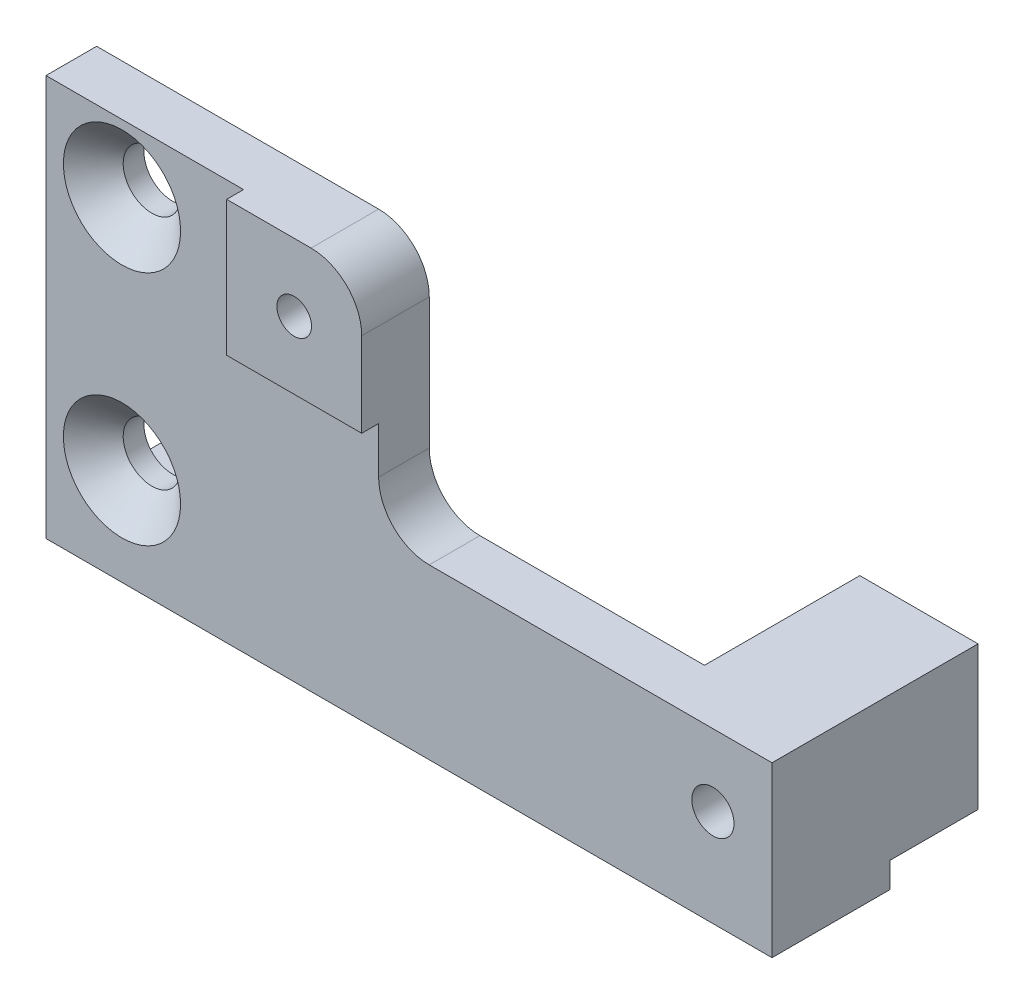
ISO-10303-21;
HEADER;
FILE_DESCRIPTION(('STEP AP214'),'2;1');
FILE_NAME('part.step','',(''),(''),'','','');
FILE_SCHEMA(('AUTOMOTIVE_DESIGN { 1 0 10303 214 1 1 1 1 }'));
ENDSEC;
DATA;
#1=APPLICATION_CONTEXT('core data for automotive mechanical design processes');
#2=APPLICATION_PROTOCOL_DEFINITION('international standard','automotive_design',2000,#1);
#3=PRODUCT_CONTEXT('',#1,'mechanical');
#4=PRODUCT('Part','Part','',(#3));
#5=PRODUCT_RELATED_PRODUCT_CATEGORY('part','',(#4));
#6=PRODUCT_DEFINITION_FORMATION('','',#4);
#7=PRODUCT_DEFINITION_CONTEXT('part definition',#1,'design');
#8=PRODUCT_DEFINITION('design','',#6,#7);
#9=PRODUCT_DEFINITION_SHAPE('','',#8);
#10=(LENGTH_UNIT() NAMED_UNIT(*) SI_UNIT(.MILLI.,.METRE.));
#11=(NAMED_UNIT(*) PLANE_ANGLE_UNIT() SI_UNIT($,.RADIAN.));
#12=(NAMED_UNIT(*) SI_UNIT($,.STERADIAN.) SOLID_ANGLE_UNIT());
#13=UNCERTAINTY_MEASURE_WITH_UNIT(LENGTH_MEASURE(1.E-05),#10,'distance_accuracy_value','');
#14=(GEOMETRIC_REPRESENTATION_CONTEXT(3) GLOBAL_UNCERTAINTY_ASSIGNED_CONTEXT((#13)) GLOBAL_UNIT_ASSIGNED_CONTEXT((#10,
#11,#12)) REPRESENTATION_CONTEXT('',''));
#15=CARTESIAN_POINT('',(0.,0.,0.));
#16=DIRECTION('',(0.,0.,1.));
#17=DIRECTION('',(1.,0.,0.));
#18=AXIS2_PLACEMENT_3D('',#15,#16,#17);
#19=CARTESIAN_POINT('',(33.,4.5,-9.19999999999995));
#20=DIRECTION('',(0.,0.,1.));
#21=DIRECTION('',(1.,0.,0.));
#22=AXIS2_PLACEMENT_3D('',#19,#20,#21);
#23=CYLINDRICAL_SURFACE('',#22,3.);
#24=DIRECTION('',(0.,0.,1.));
#25=VECTOR('',#24,1.);
#26=CARTESIAN_POINT('',(33.,1.5,-3.99999999999995));
#27=LINE('',#26,#25);
#28=CARTESIAN_POINT('',(33.,1.5,0.));
#29=VERTEX_POINT('',#28);
#30=CARTESIAN_POINT('',(33.,1.5,-3.99999999999996));
#31=VERTEX_POINT('',#30);
#32=EDGE_CURVE('E138',#29,#31,#27,.F.);
#33=ORIENTED_EDGE('',*,*,#32,.F.);
#34=CARTESIAN_POINT('',(33.,4.5,0.));
#35=DIRECTION('',(0.,0.,1.));
#36=DIRECTION('',(1.,0.,0.));
#37=AXIS2_PLACEMENT_3D('',#34,#35,#36);
#38=CIRCLE('',#37,3.);
#39=CARTESIAN_POINT('',(36.,4.5,0.));
#40=VERTEX_POINT('',#39);
#41=EDGE_CURVE('E206',#40,#29,#38,.F.);
#42=ORIENTED_EDGE('',*,*,#41,.F.);
#43=DIRECTION('',(0.,0.,-1.));
#44=VECTOR('',#43,1.);
#45=CARTESIAN_POINT('',(36.,4.5,-9.19999999999995));
#46=LINE('',#45,#44);
#47=CARTESIAN_POINT('',(36.,4.5,-3.99999999999995));
#48=VERTEX_POINT('',#47);
#49=EDGE_CURVE('E131',#40,#48,#46,.T.);
#50=ORIENTED_EDGE('',*,*,#49,.T.);
#51=CARTESIAN_POINT('',(33.,4.5,-3.99999999999996));
#52=DIRECTION('',(0.,0.,1.));
#53=DIRECTION('',(1.,0.,0.));
#54=AXIS2_PLACEMENT_3D('',#51,#52,#53);
#55=CIRCLE('',#54,3.);
#56=EDGE_CURVE('E19',#48,#31,#55,.F.);
#57=ORIENTED_EDGE('',*,*,#56,.T.);
#58=EDGE_LOOP('',(#33,#42,#50,#57));
#59=FACE_BOUND('',#58,.T.);
#60=ADVANCED_FACE('F16',(#59),#23,.F.);
#61=CARTESIAN_POINT('',(15.7,19.75,0.));
#62=DIRECTION('',(0.,0.,1.));
#63=DIRECTION('',(1.,0.,0.));
#64=AXIS2_PLACEMENT_3D('',#61,#62,#63);
#65=CYLINDRICAL_SURFACE('',#64,1.025);
#66=CARTESIAN_POINT('',(15.7,19.75,0.));
#67=DIRECTION('',(0.,0.,1.));
#68=DIRECTION('',(1.,0.,0.));
#69=AXIS2_PLACEMENT_3D('',#66,#67,#68);
#70=CIRCLE('',#69,1.025);
#71=CARTESIAN_POINT('',(16.725,19.75,0.));
#72=VERTEX_POINT('',#71);
#73=EDGE_CURVE('E154',#72,#72,#70,.T.);
#74=ORIENTED_EDGE('',*,*,#73,.F.);
#75=EDGE_LOOP('',(#74));
#76=FACE_BOUND('',#75,.T.);
#77=CARTESIAN_POINT('',(15.7,19.75,4.));
#78=DIRECTION('',(0.,0.,1.));
#79=DIRECTION('',(1.,0.,0.));
#80=AXIS2_PLACEMENT_3D('',#77,#78,#79);
#81=CIRCLE('',#80,1.025);
#82=CARTESIAN_POINT('',(16.725,19.75,4.));
#83=VERTEX_POINT('',#82);
#84=EDGE_CURVE('E203',#83,#83,#81,.F.);
#85=ORIENTED_EDGE('',*,*,#84,.F.);
#86=EDGE_LOOP('',(#85));
#87=FACE_BOUND('',#86,.T.);
#88=ADVANCED_FACE('F223',(#76,#87),#65,.F.);
#89=CARTESIAN_POINT('',(4.5,19.7500000000001,-47.));
#90=DIRECTION('',(0.,0.,-1.));
#91=DIRECTION('',(-1.,0.,0.));
#92=AXIS2_PLACEMENT_3D('',#89,#90,#91);
#93=CYLINDRICAL_SURFACE('',#92,1.7);
#94=CARTESIAN_POINT('',(4.5,19.7500000000001,1.22999999842932));
#95=DIRECTION('',(0.,0.,1.));
#96=DIRECTION('',(1.,0.,0.));
#97=AXIS2_PLACEMENT_3D('',#94,#95,#96);
#98=CIRCLE('',#97,1.7000000016269);
#99=CARTESIAN_POINT('',(6.2000000016269,19.7500000000001,1.22999999842932));
#100=VERTEX_POINT('',#99);
#101=EDGE_CURVE('E200',#100,#100,#98,.T.);
#102=ORIENTED_EDGE('',*,*,#101,.T.);
#103=EDGE_LOOP('',(#102));
#104=FACE_BOUND('',#103,.T.);
#105=CARTESIAN_POINT('',(4.5,19.7500000000001,0.));
#106=DIRECTION('',(0.,0.,-1.));
#107=DIRECTION('',(-1.,0.,0.));
#108=AXIS2_PLACEMENT_3D('',#105,#106,#107);
#109=CIRCLE('',#108,1.7);
#110=CARTESIAN_POINT('',(2.8,19.7500000000001,0.));
#111=VERTEX_POINT('',#110);
#112=EDGE_CURVE('E157',#111,#111,#109,.F.);
#113=ORIENTED_EDGE('',*,*,#112,.F.);
#114=EDGE_LOOP('',(#113));
#115=FACE_BOUND('',#114,.T.);
#116=ADVANCED_FACE('F220',(#104,#115),#93,.F.);
#117=CARTESIAN_POINT('',(4.5,5.75000000000022,-47.));
#118=DIRECTION('',(0.,0.,-1.));
#119=DIRECTION('',(-1.,0.,0.));
#120=AXIS2_PLACEMENT_3D('',#117,#118,#119);
#121=CYLINDRICAL_SURFACE('',#120,1.7);
#122=CARTESIAN_POINT('',(4.5,5.75000000000022,1.22999999842932));
#123=DIRECTION('',(0.,0.,1.));
#124=DIRECTION('',(1.,0.,0.));
#125=AXIS2_PLACEMENT_3D('',#122,#123,#124);
#126=CIRCLE('',#125,1.7000000016269);
#127=CARTESIAN_POINT('',(6.2000000016269,5.75000000000022,1.22999999842932));
#128=VERTEX_POINT('',#127);
#129=EDGE_CURVE('E425',#128,#128,#126,.T.);
#130=ORIENTED_EDGE('',*,*,#129,.T.);
#131=EDGE_LOOP('',(#130));
#132=FACE_BOUND('',#131,.T.);
#133=CARTESIAN_POINT('',(4.5,5.75000000000022,0.));
#134=DIRECTION('',(0.,0.,-1.));
#135=DIRECTION('',(-1.,0.,0.));
#136=AXIS2_PLACEMENT_3D('',#133,#134,#135);
#137=CIRCLE('',#136,1.7);
#138=CARTESIAN_POINT('',(2.8,5.75000000000022,0.));
#139=VERTEX_POINT('',#138);
#140=EDGE_CURVE('E211',#139,#139,#137,.F.);
#141=ORIENTED_EDGE('',*,*,#140,.F.);
#142=EDGE_LOOP('',(#141));
#143=FACE_BOUND('',#142,.T.);
#144=ADVANCED_FACE('F222',(#132,#143),#121,.F.);
#145=CARTESIAN_POINT('',(36.,1.5,-9.19999999999995));
#146=DIRECTION('',(1.,0.,0.));
#147=DIRECTION('',(0.,0.,-1.));
#148=AXIS2_PLACEMENT_3D('',#145,#146,#147);
#149=PLANE('',#148);
#150=ORIENTED_EDGE('',*,*,#49,.F.);
#151=DIRECTION('',(0.,1.,0.));
#152=VECTOR('',#151,1.);
#153=CARTESIAN_POINT('',(36.,0.,0.));
#154=LINE('',#153,#152);
#155=CARTESIAN_POINT('',(36.,10.,0.));
#156=VERTEX_POINT('',#155);
#157=EDGE_CURVE('E208',#156,#40,#154,.F.);
#158=ORIENTED_EDGE('',*,*,#157,.F.);
#159=DIRECTION('',(0.,0.,1.));
#160=VECTOR('',#159,1.);
#161=CARTESIAN_POINT('',(36.,10.,3.));
#162=LINE('',#161,#160);
#163=CARTESIAN_POINT('',(36.,10.,-9.19999999999998));
#164=VERTEX_POINT('',#163);
#165=EDGE_CURVE('E358',#164,#156,#162,.T.);
#166=ORIENTED_EDGE('',*,*,#165,.F.);
#167=DIRECTION('',(0.,1.,0.));
#168=VECTOR('',#167,1.);
#169=CARTESIAN_POINT('',(36.,0.,-9.19999999999995));
#170=LINE('',#169,#168);
#171=CARTESIAN_POINT('',(36.,1.5,-9.19999999999995));
#172=VERTEX_POINT('',#171);
#173=EDGE_CURVE('E352',#172,#164,#170,.T.);
#174=ORIENTED_EDGE('',*,*,#173,.F.);
#175=DIRECTION('',(0.,0.,1.));
#176=VECTOR('',#175,1.);
#177=CARTESIAN_POINT('',(36.,1.5,-9.19999999999994));
#178=LINE('',#177,#176);
#179=CARTESIAN_POINT('',(36.,1.5,-3.99999999999995));
#180=VERTEX_POINT('',#179);
#181=EDGE_CURVE('E165',#172,#180,#178,.T.);
#182=ORIENTED_EDGE('',*,*,#181,.T.);
#183=DIRECTION('',(0.,1.,0.));
#184=VECTOR('',#183,1.);
#185=CARTESIAN_POINT('',(36.,0.,-3.99999999999995));
#186=LINE('',#185,#184);
#187=EDGE_CURVE('E150',#180,#48,#186,.T.);
#188=ORIENTED_EDGE('',*,*,#187,.T.);
#189=EDGE_LOOP('',(#150,#158,#166,#174,#182,#188));
#190=FACE_BOUND('',#189,.T.);
#191=ADVANCED_FACE('F231',(#190),#149,.F.);
#192=CARTESIAN_POINT('',(43.,1.5,-9.19999999999994));
#193=DIRECTION('',(0.,1.,0.));
#194=DIRECTION('',(-1.,0.,0.));
#195=AXIS2_PLACEMENT_3D('',#192,#193,#194);
#196=PLANE('',#195);
#197=DIRECTION('',(1.,0.,0.));
#198=VECTOR('',#197,1.);
#199=CARTESIAN_POINT('',(0.,1.5,-4.));
#200=LINE('',#199,#198);
#201=CARTESIAN_POINT('',(43.,1.5,-3.99999999999998));
#202=VERTEX_POINT('',#201);
#203=EDGE_CURVE('E145',#202,#180,#200,.F.);
#204=ORIENTED_EDGE('',*,*,#203,.T.);
#205=ORIENTED_EDGE('',*,*,#181,.F.);
#206=DIRECTION('',(-1.,0.,0.));
#207=VECTOR('',#206,1.);
#208=CARTESIAN_POINT('',(0.,1.5,-9.20000000000001));
#209=LINE('',#208,#207);
#210=CARTESIAN_POINT('',(43.,1.5,-9.19999999999994));
#211=VERTEX_POINT('',#210);
#212=EDGE_CURVE('E168',#211,#172,#209,.T.);
#213=ORIENTED_EDGE('',*,*,#212,.F.);
#214=DIRECTION('',(0.,0.,-1.));
#215=VECTOR('',#214,1.);
#216=CARTESIAN_POINT('',(43.,1.5,3.));
#217=LINE('',#216,#215);
#218=EDGE_CURVE('E365',#202,#211,#217,.T.);
#219=ORIENTED_EDGE('',*,*,#218,.F.);
#220=EDGE_LOOP('',(#204,#205,#213,#219));
#221=FACE_BOUND('',#220,.T.);
#222=ADVANCED_FACE('F310',(#221),#196,.F.);
#223=CARTESIAN_POINT('',(0.,0.,-9.20000000000001));
#224=DIRECTION('',(0.,0.,-1.));
#225=DIRECTION('',(-1.,0.,0.));
#226=AXIS2_PLACEMENT_3D('',#223,#224,#225);
#227=PLANE('',#226);
#228=DIRECTION('',(-1.,0.,0.));
#229=VECTOR('',#228,1.);
#230=CARTESIAN_POINT('',(19.7,10.,-9.2));
#231=LINE('',#230,#229);
#232=CARTESIAN_POINT('',(43.,10.,-9.19999999999996));
#233=VERTEX_POINT('',#232);
#234=EDGE_CURVE('E355',#233,#164,#231,.T.);
#235=ORIENTED_EDGE('',*,*,#234,.F.);
#236=DIRECTION('',(0.,1.,0.));
#237=VECTOR('',#236,1.);
#238=CARTESIAN_POINT('',(43.,10.,-9.19999999999994));
#239=LINE('',#238,#237);
#240=EDGE_CURVE('E362',#211,#233,#239,.T.);
#241=ORIENTED_EDGE('',*,*,#240,.F.);
#242=ORIENTED_EDGE('',*,*,#212,.T.);
#243=ORIENTED_EDGE('',*,*,#173,.T.);
#244=EDGE_LOOP('',(#235,#241,#242,#243));
#245=FACE_BOUND('',#244,.T.);
#246=CARTESIAN_POINT('',(39.5000000000002,5.74999999999989,-9.19999999999994));
#247=DIRECTION('',(0.,0.,-1.));
#248=DIRECTION('',(-1.,0.,0.));
#249=AXIS2_PLACEMENT_3D('',#246,#247,#248);
#250=CIRCLE('',#249,1.25);
#251=CARTESIAN_POINT('',(38.2500000000002,5.74999999999989,-9.19999999999994));
#252=VERTEX_POINT('',#251);
#253=EDGE_CURVE('E197',#252,#252,#250,.F.);
#254=ORIENTED_EDGE('',*,*,#253,.T.);
#255=EDGE_LOOP('',(#254));
#256=FACE_BOUND('',#255,.T.);
#257=ADVANCED_FACE('F307',(#245,#256),#227,.T.);
#258=CARTESIAN_POINT('',(0.,0.,-4.));
#259=DIRECTION('',(0.,0.,1.));
#260=DIRECTION('',(1.,0.,0.));
#261=AXIS2_PLACEMENT_3D('',#258,#259,#260);
#262=PLANE('',#261);
#263=DIRECTION('',(0.,1.,0.));
#264=VECTOR('',#263,1.);
#265=CARTESIAN_POINT('',(43.,10.,-4.));
#266=LINE('',#265,#264);
#267=CARTESIAN_POINT('',(43.,0.,-4.));
#268=VERTEX_POINT('',#267);
#269=EDGE_CURVE('E373',#268,#202,#266,.T.);
#270=ORIENTED_EDGE('',*,*,#269,.F.);
#271=DIRECTION('',(1.,0.,0.));
#272=VECTOR('',#271,1.);
#273=CARTESIAN_POINT('',(43.,0.,-4.));
#274=LINE('',#273,#272);
#275=CARTESIAN_POINT('',(0.,0.,-4.));
#276=VERTEX_POINT('',#275);
#277=EDGE_CURVE('E384',#276,#268,#274,.T.);
#278=ORIENTED_EDGE('',*,*,#277,.F.);
#279=DIRECTION('',(0.,1.,0.));
#280=VECTOR('',#279,1.);
#281=CARTESIAN_POINT('',(0.,0.,-4.));
#282=LINE('',#281,#280);
#283=CARTESIAN_POINT('',(0.,1.5,-3.99999999999998));
#284=VERTEX_POINT('',#283);
#285=EDGE_CURVE('E149',#284,#276,#282,.F.);
#286=ORIENTED_EDGE('',*,*,#285,.F.);
#287=DIRECTION('',(-1.,0.,0.));
#288=VECTOR('',#287,1.);
#289=CARTESIAN_POINT('',(36.,1.5,-3.99999999999996));
#290=LINE('',#289,#288);
#291=EDGE_CURVE('E142',#31,#284,#290,.T.);
#292=ORIENTED_EDGE('',*,*,#291,.F.);
#293=ORIENTED_EDGE('',*,*,#56,.F.);
#294=ORIENTED_EDGE('',*,*,#187,.F.);
#295=ORIENTED_EDGE('',*,*,#203,.F.);
#296=EDGE_LOOP('',(#270,#278,#286,#292,#293,#294,#295));
#297=FACE_BOUND('',#296,.T.);
#298=ADVANCED_FACE('F152',(#297),#262,.F.);
#299=CARTESIAN_POINT('',(36.,1.5,-3.99999999999995));
#300=DIRECTION('',(0.,1.,0.));
#301=DIRECTION('',(-1.,0.,0.));
#302=AXIS2_PLACEMENT_3D('',#299,#300,#301);
#303=PLANE('',#302);
#304=ORIENTED_EDGE('',*,*,#291,.T.);
#305=DIRECTION('',(0.,0.,1.));
#306=VECTOR('',#305,1.);
#307=CARTESIAN_POINT('',(0.,1.5,3.));
#308=LINE('',#307,#306);
#309=CARTESIAN_POINT('',(0.,1.5,0.));
#310=VERTEX_POINT('',#309);
#311=EDGE_CURVE('E174',#310,#284,#308,.F.);
#312=ORIENTED_EDGE('',*,*,#311,.F.);
#313=DIRECTION('',(-1.,0.,0.));
#314=VECTOR('',#313,1.);
#315=CARTESIAN_POINT('',(0.,1.5,0.));
#316=LINE('',#315,#314);
#317=EDGE_CURVE('E144',#29,#310,#316,.T.);
#318=ORIENTED_EDGE('',*,*,#317,.F.);
#319=ORIENTED_EDGE('',*,*,#32,.T.);
#320=EDGE_LOOP('',(#304,#312,#318,#319));
#321=FACE_BOUND('',#320,.T.);
#322=ADVANCED_FACE('F139',(#321),#303,.T.);
#323=CARTESIAN_POINT('',(16.7,20.75,3.));
#324=DIRECTION('',(0.,0.,-1.));
#325=DIRECTION('',(-1.,0.,0.));
#326=AXIS2_PLACEMENT_3D('',#323,#324,#325);
#327=CYLINDRICAL_SURFACE('',#326,3.);
#328=CARTESIAN_POINT('',(16.7,20.75,0.));
#329=DIRECTION('',(0.,0.,-1.));
#330=DIRECTION('',(-1.,0.,0.));
#331=AXIS2_PLACEMENT_3D('',#328,#329,#330);
#332=CIRCLE('',#331,3.);
#333=CARTESIAN_POINT('',(16.7,23.75,0.));
#334=VERTEX_POINT('',#333);
#335=CARTESIAN_POINT('',(19.7,20.75,0.));
#336=VERTEX_POINT('',#335);
#337=EDGE_CURVE('E209',#334,#336,#332,.T.);
#338=ORIENTED_EDGE('',*,*,#337,.F.);
#339=DIRECTION('',(0.,0.,1.));
#340=VECTOR('',#339,1.);
#341=CARTESIAN_POINT('',(16.7,23.75,3.));
#342=LINE('',#341,#340);
#343=CARTESIAN_POINT('',(16.7,23.75,4.));
#344=VERTEX_POINT('',#343);
#345=EDGE_CURVE('E331',#344,#334,#342,.F.);
#346=ORIENTED_EDGE('',*,*,#345,.F.);
#347=CARTESIAN_POINT('',(16.7,20.75,4.));
#348=DIRECTION('',(0.,0.,-1.));
#349=DIRECTION('',(-1.,0.,0.));
#350=AXIS2_PLACEMENT_3D('',#347,#348,#349);
#351=CIRCLE('',#350,3.);
#352=CARTESIAN_POINT('',(19.7,20.75,4.00000000000003));
#353=VERTEX_POINT('',#352);
#354=EDGE_CURVE('E201',#353,#344,#351,.F.);
#355=ORIENTED_EDGE('',*,*,#354,.F.);
#356=DIRECTION('',(0.,0.,1.));
#357=VECTOR('',#356,1.);
#358=CARTESIAN_POINT('',(19.7,20.75,3.00000000000007));
#359=LINE('',#358,#357);
#360=EDGE_CURVE('E403',#336,#353,#359,.T.);
#361=ORIENTED_EDGE('',*,*,#360,.F.);
#362=EDGE_LOOP('',(#338,#346,#355,#361));
#363=FACE_BOUND('',#362,.T.);
#364=ADVANCED_FACE('F298',(#363),#327,.T.);
#365=CARTESIAN_POINT('',(0.,0.,0.));
#366=DIRECTION('',(0.,0.,-1.));
#367=DIRECTION('',(-1.,0.,0.));
#368=AXIS2_PLACEMENT_3D('',#365,#366,#367);
#369=PLANE('',#368);
#370=ORIENTED_EDGE('',*,*,#317,.T.);
#371=DIRECTION('',(0.,1.,0.));
#372=VECTOR('',#371,1.);
#373=CARTESIAN_POINT('',(0.,0.,0.));
#374=LINE('',#373,#372);
#375=CARTESIAN_POINT('',(0.,23.75,0.));
#376=VERTEX_POINT('',#375);
#377=EDGE_CURVE('E338',#376,#310,#374,.F.);
#378=ORIENTED_EDGE('',*,*,#377,.F.);
#379=DIRECTION('',(1.,0.,0.));
#380=VECTOR('',#379,1.);
#381=CARTESIAN_POINT('',(0.,23.75,0.));
#382=LINE('',#381,#380);
#383=EDGE_CURVE('E333',#334,#376,#382,.F.);
#384=ORIENTED_EDGE('',*,*,#383,.F.);
#385=ORIENTED_EDGE('',*,*,#337,.T.);
#386=DIRECTION('',(0.,1.,0.));
#387=VECTOR('',#386,1.);
#388=CARTESIAN_POINT('',(19.7,23.75,0.));
#389=LINE('',#388,#387);
#390=CARTESIAN_POINT('',(19.7,13.,0.));
#391=VERTEX_POINT('',#390);
#392=EDGE_CURVE('E400',#391,#336,#389,.T.);
#393=ORIENTED_EDGE('',*,*,#392,.F.);
#394=CARTESIAN_POINT('',(22.7,13.,0.));
#395=DIRECTION('',(0.,0.,1.));
#396=DIRECTION('',(1.,0.,0.));
#397=AXIS2_PLACEMENT_3D('',#394,#395,#396);
#398=CIRCLE('',#397,3.);
#399=CARTESIAN_POINT('',(22.7,10.,0.));
#400=VERTEX_POINT('',#399);
#401=EDGE_CURVE('E192',#391,#400,#398,.T.);
#402=ORIENTED_EDGE('',*,*,#401,.T.);
#403=DIRECTION('',(-1.,0.,0.));
#404=VECTOR('',#403,1.);
#405=CARTESIAN_POINT('',(19.7,10.,0.));
#406=LINE('',#405,#404);
#407=EDGE_CURVE('E195',#156,#400,#406,.T.);
#408=ORIENTED_EDGE('',*,*,#407,.F.);
#409=ORIENTED_EDGE('',*,*,#157,.T.);
#410=ORIENTED_EDGE('',*,*,#41,.T.);
#411=EDGE_LOOP('',(#370,#378,#384,#385,#393,#402,#408,#409,#410));
#412=FACE_BOUND('',#411,.T.);
#413=ORIENTED_EDGE('',*,*,#140,.T.);
#414=EDGE_LOOP('',(#413));
#415=FACE_BOUND('',#414,.T.);
#416=ORIENTED_EDGE('',*,*,#112,.T.);
#417=EDGE_LOOP('',(#416));
#418=FACE_BOUND('',#417,.T.);
#419=ORIENTED_EDGE('',*,*,#73,.T.);
#420=EDGE_LOOP('',(#419));
#421=FACE_BOUND('',#420,.T.);
#422=ADVANCED_FACE('F217',(#412,#415,#418,#421),#369,.T.);
#423=CARTESIAN_POINT('',(0.,0.,4.));
#424=DIRECTION('',(0.,0.,1.));
#425=DIRECTION('',(1.,0.,0.));
#426=AXIS2_PLACEMENT_3D('',#423,#424,#425);
#427=PLANE('',#426);
#428=DIRECTION('',(0.,1.,0.));
#429=VECTOR('',#428,1.);
#430=CARTESIAN_POINT('',(11.7,23.75,4.));
#431=LINE('',#430,#429);
#432=CARTESIAN_POINT('',(11.7,23.75,4.));
#433=VERTEX_POINT('',#432);
#434=CARTESIAN_POINT('',(11.7,15.75,4.));
#435=VERTEX_POINT('',#434);
#436=EDGE_CURVE('E345',#433,#435,#431,.F.);
#437=ORIENTED_EDGE('',*,*,#436,.T.);
#438=DIRECTION('',(1.,0.,0.));
#439=VECTOR('',#438,1.);
#440=CARTESIAN_POINT('',(11.7,15.75,4.));
#441=LINE('',#440,#439);
#442=CARTESIAN_POINT('',(19.7,15.75,4.00000000000004));
#443=VERTEX_POINT('',#442);
#444=EDGE_CURVE('E404',#435,#443,#441,.T.);
#445=ORIENTED_EDGE('',*,*,#444,.T.);
#446=DIRECTION('',(0.,1.,0.));
#447=VECTOR('',#446,1.);
#448=CARTESIAN_POINT('',(19.7,23.75,4.00000000000006));
#449=LINE('',#448,#447);
#450=EDGE_CURVE('E405',#353,#443,#449,.F.);
#451=ORIENTED_EDGE('',*,*,#450,.F.);
#452=ORIENTED_EDGE('',*,*,#354,.T.);
#453=DIRECTION('',(1.,0.,0.));
#454=VECTOR('',#453,1.);
#455=CARTESIAN_POINT('',(0.,23.75,4.));
#456=LINE('',#455,#454);
#457=EDGE_CURVE('E173',#433,#344,#456,.T.);
#458=ORIENTED_EDGE('',*,*,#457,.F.);
#459=EDGE_LOOP('',(#437,#445,#451,#452,#458));
#460=FACE_BOUND('',#459,.T.);
#461=ORIENTED_EDGE('',*,*,#84,.T.);
#462=EDGE_LOOP('',(#461));
#463=FACE_BOUND('',#462,.T.);
#464=ADVANCED_FACE('F291',(#460,#463),#427,.T.);
#465=CARTESIAN_POINT('',(39.5000000000002,5.74999999999989,3.));
#466=DIRECTION('',(0.,0.,-1.));
#467=DIRECTION('',(-1.,0.,0.));
#468=AXIS2_PLACEMENT_3D('',#465,#466,#467);
#469=CYLINDRICAL_SURFACE('',#468,1.25);
#470=CARTESIAN_POINT('',(39.5000000000002,5.74999999999989,3.));
#471=DIRECTION('',(0.,0.,-1.));
#472=DIRECTION('',(-1.,0.,0.));
#473=AXIS2_PLACEMENT_3D('',#470,#471,#472);
#474=CIRCLE('',#473,1.25);
#475=CARTESIAN_POINT('',(38.2500000000002,5.74999999999989,3.));
#476=VERTEX_POINT('',#475);
#477=EDGE_CURVE('E189',#476,#476,#474,.F.);
#478=ORIENTED_EDGE('',*,*,#477,.T.);
#479=EDGE_LOOP('',(#478));
#480=FACE_BOUND('',#479,.T.);
#481=ORIENTED_EDGE('',*,*,#253,.F.);
#482=EDGE_LOOP('',(#481));
#483=FACE_BOUND('',#482,.T.);
#484=ADVANCED_FACE('F287',(#480,#483),#469,.F.);
#485=CARTESIAN_POINT('',(4.5,19.7500000000001,2.99999999992906));
#486=DIRECTION('',(0.,0.,1.));
#487=DIRECTION('',(1.,0.,0.));
#488=AXIS2_PLACEMENT_3D('',#485,#486,#487);
#489=CONICAL_SURFACE('',#488,3.47000000000025,0.785398162514288);
#490=CARTESIAN_POINT('',(4.5,19.7500000000001,2.99999999992906));
#491=DIRECTION('',(0.,0.,1.));
#492=DIRECTION('',(1.,0.,0.));
#493=AXIS2_PLACEMENT_3D('',#490,#491,#492);
#494=CIRCLE('',#493,3.47000000000025);
#495=CARTESIAN_POINT('',(7.97000000000025,19.7500000000001,2.99999999992906));
#496=VERTEX_POINT('',#495);
#497=EDGE_CURVE('E186',#496,#496,#494,.T.);
#498=ORIENTED_EDGE('',*,*,#497,.T.);
#499=EDGE_LOOP('',(#498));
#500=FACE_BOUND('',#499,.T.);
#501=ORIENTED_EDGE('',*,*,#101,.F.);
#502=EDGE_LOOP('',(#501));
#503=FACE_BOUND('',#502,.T.);
#504=ADVANCED_FACE('F283',(#500,#503),#489,.F.);
#505=CARTESIAN_POINT('',(4.5,5.75000000000022,2.99999999992906));
#506=DIRECTION('',(0.,0.,1.));
#507=DIRECTION('',(1.,0.,0.));
#508=AXIS2_PLACEMENT_3D('',#505,#506,#507);
#509=CONICAL_SURFACE('',#508,3.47000000000025,0.785398162514288);
#510=CARTESIAN_POINT('',(4.5,5.75000000000022,2.99999999992906));
#511=DIRECTION('',(0.,0.,1.));
#512=DIRECTION('',(1.,0.,0.));
#513=AXIS2_PLACEMENT_3D('',#510,#511,#512);
#514=CIRCLE('',#513,3.47000000000025);
#515=CARTESIAN_POINT('',(7.97000000000025,5.75000000000022,2.99999999992906));
#516=VERTEX_POINT('',#515);
#517=EDGE_CURVE('E182',#516,#516,#514,.T.);
#518=ORIENTED_EDGE('',*,*,#517,.T.);
#519=EDGE_LOOP('',(#518));
#520=FACE_BOUND('',#519,.T.);
#521=ORIENTED_EDGE('',*,*,#129,.F.);
#522=EDGE_LOOP('',(#521));
#523=FACE_BOUND('',#522,.T.);
#524=ADVANCED_FACE('F279',(#520,#523),#509,.F.);
#525=CARTESIAN_POINT('',(11.7,15.75,4.));
#526=DIRECTION('',(0.,1.,0.));
#527=DIRECTION('',(0.,0.,1.));
#528=AXIS2_PLACEMENT_3D('',#525,#526,#527);
#529=PLANE('',#528);
#530=DIRECTION('',(-1.,0.,0.));
#531=VECTOR('',#530,1.);
#532=CARTESIAN_POINT('',(0.,15.75,3.));
#533=LINE('',#532,#531);
#534=CARTESIAN_POINT('',(11.7,15.75,3.));
#535=VERTEX_POINT('',#534);
#536=CARTESIAN_POINT('',(19.7,15.75,3.));
#537=VERTEX_POINT('',#536);
#538=EDGE_CURVE('E185',#535,#537,#533,.F.);
#539=ORIENTED_EDGE('',*,*,#538,.T.);
#540=DIRECTION('',(0.,0.,1.));
#541=VECTOR('',#540,1.);
#542=CARTESIAN_POINT('',(19.7,15.75,3.00000000000007));
#543=LINE('',#542,#541);
#544=EDGE_CURVE('E407',#443,#537,#543,.F.);
#545=ORIENTED_EDGE('',*,*,#544,.F.);
#546=ORIENTED_EDGE('',*,*,#444,.F.);
#547=DIRECTION('',(0.,0.,1.));
#548=VECTOR('',#547,1.);
#549=CARTESIAN_POINT('',(11.7,15.75,4.));
#550=LINE('',#549,#548);
#551=EDGE_CURVE('E438',#435,#535,#550,.F.);
#552=ORIENTED_EDGE('',*,*,#551,.T.);
#553=EDGE_LOOP('',(#539,#545,#546,#552));
#554=FACE_BOUND('',#553,.T.);
#555=ADVANCED_FACE('F275',(#554),#529,.F.);
#556=CARTESIAN_POINT('',(19.7,23.75,3.00000000000007));
#557=DIRECTION('',(1.,0.,0.));
#558=DIRECTION('',(0.,1.,0.));
#559=AXIS2_PLACEMENT_3D('',#556,#557,#558);
#560=PLANE('',#559);
#561=DIRECTION('',(0.,1.,0.));
#562=VECTOR('',#561,1.);
#563=CARTESIAN_POINT('',(19.7,0.,3.));
#564=LINE('',#563,#562);
#565=CARTESIAN_POINT('',(19.7,13.,3.));
#566=VERTEX_POINT('',#565);
#567=EDGE_CURVE('E181',#537,#566,#564,.F.);
#568=ORIENTED_EDGE('',*,*,#567,.T.);
#569=DIRECTION('',(0.,0.,1.));
#570=VECTOR('',#569,1.);
#571=CARTESIAN_POINT('',(19.7,13.,3.00000000000007));
#572=LINE('',#571,#570);
#573=EDGE_CURVE('E196',#566,#391,#572,.F.);
#574=ORIENTED_EDGE('',*,*,#573,.T.);
#575=ORIENTED_EDGE('',*,*,#392,.T.);
#576=ORIENTED_EDGE('',*,*,#360,.T.);
#577=ORIENTED_EDGE('',*,*,#450,.T.);
#578=ORIENTED_EDGE('',*,*,#544,.T.);
#579=EDGE_LOOP('',(#568,#574,#575,#576,#577,#578));
#580=FACE_BOUND('',#579,.T.);
#581=ADVANCED_FACE('F271',(#580),#560,.T.);
#582=CARTESIAN_POINT('',(22.7,13.,3.00000000000007));
#583=DIRECTION('',(0.,0.,1.));
#584=DIRECTION('',(1.,0.,0.));
#585=AXIS2_PLACEMENT_3D('',#582,#583,#584);
#586=CYLINDRICAL_SURFACE('',#585,3.);
#587=DIRECTION('',(0.,0.,1.));
#588=VECTOR('',#587,1.);
#589=CARTESIAN_POINT('',(22.7,10.,3.));
#590=LINE('',#589,#588);
#591=CARTESIAN_POINT('',(22.7,10.,3.));
#592=VERTEX_POINT('',#591);
#593=EDGE_CURVE('E359',#400,#592,#590,.T.);
#594=ORIENTED_EDGE('',*,*,#593,.F.);
#595=ORIENTED_EDGE('',*,*,#401,.F.);
#596=ORIENTED_EDGE('',*,*,#573,.F.);
#597=CARTESIAN_POINT('',(22.7,13.,3.));
#598=DIRECTION('',(0.,0.,1.));
#599=DIRECTION('',(1.,0.,0.));
#600=AXIS2_PLACEMENT_3D('',#597,#598,#599);
#601=CIRCLE('',#600,3.);
#602=EDGE_CURVE('E177',#566,#592,#601,.T.);
#603=ORIENTED_EDGE('',*,*,#602,.T.);
#604=EDGE_LOOP('',(#594,#595,#596,#603));
#605=FACE_BOUND('',#604,.T.);
#606=ADVANCED_FACE('F267',(#605),#586,.F.);
#607=CARTESIAN_POINT('',(19.7,10.,3.));
#608=DIRECTION('',(0.,1.,0.));
#609=DIRECTION('',(-1.,0.,0.));
#610=AXIS2_PLACEMENT_3D('',#607,#608,#609);
#611=PLANE('',#610);
#612=ORIENTED_EDGE('',*,*,#234,.T.);
#613=ORIENTED_EDGE('',*,*,#165,.T.);
#614=ORIENTED_EDGE('',*,*,#407,.T.);
#615=ORIENTED_EDGE('',*,*,#593,.T.);
#616=DIRECTION('',(-1.,0.,0.));
#617=VECTOR('',#616,1.);
#618=CARTESIAN_POINT('',(0.,10.,3.));
#619=LINE('',#618,#617);
#620=CARTESIAN_POINT('',(43.,10.,3.));
#621=VERTEX_POINT('',#620);
#622=EDGE_CURVE('E180',#592,#621,#619,.F.);
#623=ORIENTED_EDGE('',*,*,#622,.T.);
#624=DIRECTION('',(0.,0.,-1.));
#625=VECTOR('',#624,1.);
#626=CARTESIAN_POINT('',(43.,10.,3.));
#627=LINE('',#626,#625);
#628=EDGE_CURVE('E364',#233,#621,#627,.F.);
#629=ORIENTED_EDGE('',*,*,#628,.F.);
#630=EDGE_LOOP('',(#612,#613,#614,#615,#623,#629));
#631=FACE_BOUND('',#630,.T.);
#632=ADVANCED_FACE('F263',(#631),#611,.T.);
#633=CARTESIAN_POINT('',(43.,10.,3.));
#634=DIRECTION('',(1.,0.,0.));
#635=DIRECTION('',(0.,0.,-1.));
#636=AXIS2_PLACEMENT_3D('',#633,#634,#635);
#637=PLANE('',#636);
#638=ORIENTED_EDGE('',*,*,#628,.T.);
#639=DIRECTION('',(0.,1.,0.));
#640=VECTOR('',#639,1.);
#641=CARTESIAN_POINT('',(43.,0.,3.));
#642=LINE('',#641,#640);
#643=CARTESIAN_POINT('',(43.,0.,3.));
#644=VERTEX_POINT('',#643);
#645=EDGE_CURVE('E475',#621,#644,#642,.F.);
#646=ORIENTED_EDGE('',*,*,#645,.T.);
#647=DIRECTION('',(0.,0.,1.));
#648=VECTOR('',#647,1.);
#649=CARTESIAN_POINT('',(43.,0.,3.));
#650=LINE('',#649,#648);
#651=EDGE_CURVE('E341',#268,#644,#650,.T.);
#652=ORIENTED_EDGE('',*,*,#651,.F.);
#653=ORIENTED_EDGE('',*,*,#269,.T.);
#654=ORIENTED_EDGE('',*,*,#218,.T.);
#655=ORIENTED_EDGE('',*,*,#240,.T.);
#656=EDGE_LOOP('',(#638,#646,#652,#653,#654,#655));
#657=FACE_BOUND('',#656,.T.);
#658=ADVANCED_FACE('F259',(#657),#637,.T.);
#659=CARTESIAN_POINT('',(43.,0.,3.));
#660=DIRECTION('',(0.,-1.,0.));
#661=DIRECTION('',(1.,0.,0.));
#662=AXIS2_PLACEMENT_3D('',#659,#660,#661);
#663=PLANE('',#662);
#664=ORIENTED_EDGE('',*,*,#651,.T.);
#665=DIRECTION('',(-1.,0.,0.));
#666=VECTOR('',#665,1.);
#667=CARTESIAN_POINT('',(0.,0.,3.));
#668=LINE('',#667,#666);
#669=CARTESIAN_POINT('',(0.,0.,3.));
#670=VERTEX_POINT('',#669);
#671=EDGE_CURVE('E471',#644,#670,#668,.T.);
#672=ORIENTED_EDGE('',*,*,#671,.T.);
#673=DIRECTION('',(0.,0.,1.));
#674=VECTOR('',#673,1.);
#675=CARTESIAN_POINT('',(0.,0.,3.));
#676=LINE('',#675,#674);
#677=EDGE_CURVE('E171',#276,#670,#676,.T.);
#678=ORIENTED_EDGE('',*,*,#677,.F.);
#679=ORIENTED_EDGE('',*,*,#277,.T.);
#680=EDGE_LOOP('',(#664,#672,#678,#679));
#681=FACE_BOUND('',#680,.T.);
#682=ADVANCED_FACE('F255',(#681),#663,.T.);
#683=CARTESIAN_POINT('',(0.,0.,3.));
#684=DIRECTION('',(-1.,0.,0.));
#685=DIRECTION('',(0.,0.,1.));
#686=AXIS2_PLACEMENT_3D('',#683,#684,#685);
#687=PLANE('',#686);
#688=DIRECTION('',(0.,1.,0.));
#689=VECTOR('',#688,1.);
#690=CARTESIAN_POINT('',(0.,0.,3.));
#691=LINE('',#690,#689);
#692=CARTESIAN_POINT('',(0.,23.75,3.));
#693=VERTEX_POINT('',#692);
#694=EDGE_CURVE('E466',#670,#693,#691,.T.);
#695=ORIENTED_EDGE('',*,*,#694,.T.);
#696=DIRECTION('',(0.,0.,1.));
#697=VECTOR('',#696,1.);
#698=CARTESIAN_POINT('',(0.,23.75,3.));
#699=LINE('',#698,#697);
#700=EDGE_CURVE('E335',#376,#693,#699,.T.);
#701=ORIENTED_EDGE('',*,*,#700,.F.);
#702=ORIENTED_EDGE('',*,*,#377,.T.);
#703=ORIENTED_EDGE('',*,*,#311,.T.);
#704=ORIENTED_EDGE('',*,*,#285,.T.);
#705=ORIENTED_EDGE('',*,*,#677,.T.);
#706=EDGE_LOOP('',(#695,#701,#702,#703,#704,#705));
#707=FACE_BOUND('',#706,.T.);
#708=ADVANCED_FACE('F251',(#707),#687,.T.);
#709=CARTESIAN_POINT('',(0.,23.75,3.));
#710=DIRECTION('',(0.,1.,0.));
#711=DIRECTION('',(0.,0.,1.));
#712=AXIS2_PLACEMENT_3D('',#709,#710,#711);
#713=PLANE('',#712);
#714=DIRECTION('',(-1.,0.,0.));
#715=VECTOR('',#714,1.);
#716=CARTESIAN_POINT('',(0.,23.75,3.));
#717=LINE('',#716,#715);
#718=CARTESIAN_POINT('',(11.7,23.75,3.));
#719=VERTEX_POINT('',#718);
#720=EDGE_CURVE('E25',#693,#719,#717,.F.);
#721=ORIENTED_EDGE('',*,*,#720,.T.);
#722=DIRECTION('',(0.,0.,1.));
#723=VECTOR('',#722,1.);
#724=CARTESIAN_POINT('',(11.7,23.75,4.));
#725=LINE('',#724,#723);
#726=EDGE_CURVE('E33',#719,#433,#725,.T.);
#727=ORIENTED_EDGE('',*,*,#726,.T.);
#728=ORIENTED_EDGE('',*,*,#457,.T.);
#729=ORIENTED_EDGE('',*,*,#345,.T.);
#730=ORIENTED_EDGE('',*,*,#383,.T.);
#731=ORIENTED_EDGE('',*,*,#700,.T.);
#732=EDGE_LOOP('',(#721,#727,#728,#729,#730,#731));
#733=FACE_BOUND('',#732,.T.);
#734=ADVANCED_FACE('F244',(#733),#713,.T.);
#735=CARTESIAN_POINT('',(11.7,23.75,4.));
#736=DIRECTION('',(1.,0.,0.));
#737=DIRECTION('',(0.,1.,0.));
#738=AXIS2_PLACEMENT_3D('',#735,#736,#737);
#739=PLANE('',#738);
#740=DIRECTION('',(0.,1.,0.));
#741=VECTOR('',#740,1.);
#742=CARTESIAN_POINT('',(11.7,0.,3.));
#743=LINE('',#742,#741);
#744=EDGE_CURVE('E11',#719,#535,#743,.F.);
#745=ORIENTED_EDGE('',*,*,#744,.T.);
#746=ORIENTED_EDGE('',*,*,#551,.F.);
#747=ORIENTED_EDGE('',*,*,#436,.F.);
#748=ORIENTED_EDGE('',*,*,#726,.F.);
#749=EDGE_LOOP('',(#745,#746,#747,#748));
#750=FACE_BOUND('',#749,.T.);
#751=ADVANCED_FACE('F238',(#750),#739,.F.);
#752=CARTESIAN_POINT('',(0.,0.,3.));
#753=DIRECTION('',(0.,0.,-1.));
#754=DIRECTION('',(-1.,0.,0.));
#755=AXIS2_PLACEMENT_3D('',#752,#753,#754);
#756=PLANE('',#755);
#757=ORIENTED_EDGE('',*,*,#720,.F.);
#758=ORIENTED_EDGE('',*,*,#694,.F.);
#759=ORIENTED_EDGE('',*,*,#671,.F.);
#760=ORIENTED_EDGE('',*,*,#645,.F.);
#761=ORIENTED_EDGE('',*,*,#622,.F.);
#762=ORIENTED_EDGE('',*,*,#602,.F.);
#763=ORIENTED_EDGE('',*,*,#567,.F.);
#764=ORIENTED_EDGE('',*,*,#538,.F.);
#765=ORIENTED_EDGE('',*,*,#744,.F.);
#766=EDGE_LOOP('',(#757,#758,#759,#760,#761,#762,#763,#764,#765));
#767=FACE_BOUND('',#766,.T.);
#768=ORIENTED_EDGE('',*,*,#517,.F.);
#769=EDGE_LOOP('',(#768));
#770=FACE_BOUND('',#769,.T.);
#771=ORIENTED_EDGE('',*,*,#497,.F.);
#772=EDGE_LOOP('',(#771));
#773=FACE_BOUND('',#772,.T.);
#774=ORIENTED_EDGE('',*,*,#477,.F.);
#775=EDGE_LOOP('',(#774));
#776=FACE_BOUND('',#775,.T.);
#777=ADVANCED_FACE('F236',(#767,#770,#773,#776),#756,.F.);
#778=CLOSED_SHELL('',(#60,#88,#116,#144,#191,#222,#257,#298,#322,#364,#422,#464,#484,#504,#524,
#555,#581,#606,#632,#658,#682,#708,#734,#751,#777));
#779=MANIFOLD_SOLID_BREP('B1',#778);
#780=ADVANCED_BREP_SHAPE_REPRESENTATION('',(#18,#779),#14);
#781=SHAPE_DEFINITION_REPRESENTATION(#9,#780);
ENDSEC;
END-ISO-10303-21;
